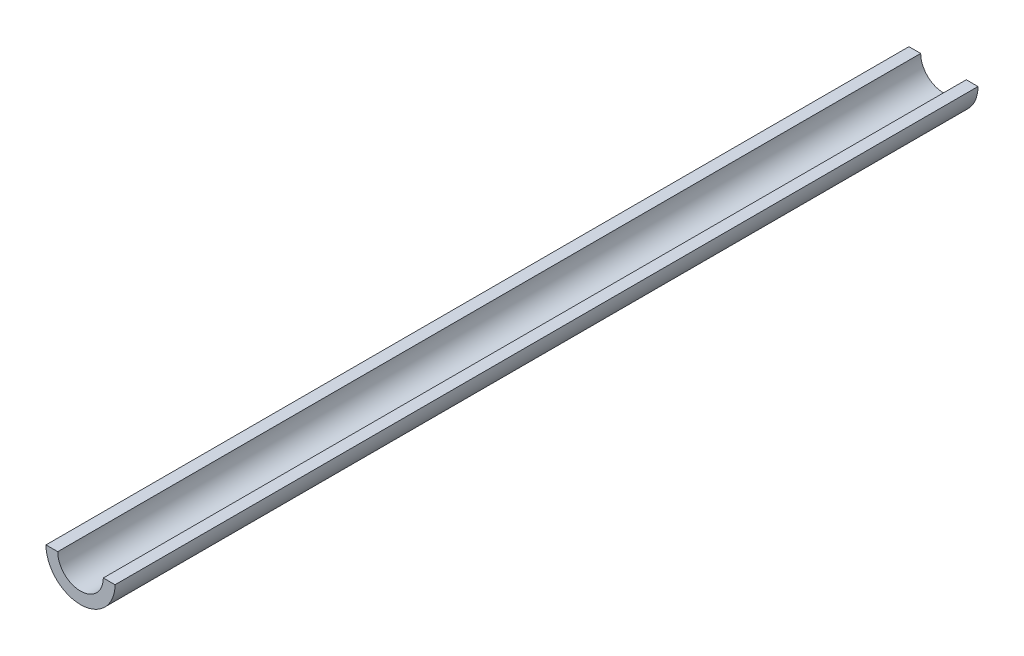
ISO-10303-21;
HEADER;
FILE_DESCRIPTION(('STEP AP214'),'2;1');
FILE_NAME('part.step','',(''),(''),'','','');
FILE_SCHEMA(('AUTOMOTIVE_DESIGN { 1 0 10303 214 1 1 1 1 }'));
ENDSEC;
DATA;
#1=APPLICATION_CONTEXT('core data for automotive mechanical design processes');
#2=APPLICATION_PROTOCOL_DEFINITION('international standard','automotive_design',2000,#1);
#3=PRODUCT_CONTEXT('',#1,'mechanical');
#4=PRODUCT('Part','Part','',(#3));
#5=PRODUCT_RELATED_PRODUCT_CATEGORY('part','',(#4));
#6=PRODUCT_DEFINITION_FORMATION('','',#4);
#7=PRODUCT_DEFINITION_CONTEXT('part definition',#1,'design');
#8=PRODUCT_DEFINITION('design','',#6,#7);
#9=PRODUCT_DEFINITION_SHAPE('','',#8);
#10=(LENGTH_UNIT() NAMED_UNIT(*) SI_UNIT(.MILLI.,.METRE.));
#11=(NAMED_UNIT(*) PLANE_ANGLE_UNIT() SI_UNIT($,.RADIAN.));
#12=(NAMED_UNIT(*) SI_UNIT($,.STERADIAN.) SOLID_ANGLE_UNIT());
#13=UNCERTAINTY_MEASURE_WITH_UNIT(LENGTH_MEASURE(1.E-05),#10,'distance_accuracy_value','');
#14=(GEOMETRIC_REPRESENTATION_CONTEXT(3) GLOBAL_UNCERTAINTY_ASSIGNED_CONTEXT((#13)) GLOBAL_UNIT_ASSIGNED_CONTEXT((#10,
#11,#12)) REPRESENTATION_CONTEXT('',''));
#15=CARTESIAN_POINT('',(0.,0.,0.));
#16=DIRECTION('',(0.,0.,1.));
#17=DIRECTION('',(1.,0.,0.));
#18=AXIS2_PLACEMENT_3D('',#15,#16,#17);
#19=CARTESIAN_POINT('',(0.,0.,125.));
#20=DIRECTION('',(0.,0.,-1.));
#21=DIRECTION('',(-1.,0.,0.));
#22=AXIS2_PLACEMENT_3D('',#19,#20,#21);
#23=CYLINDRICAL_SURFACE('',#22,6.6);
#24=CARTESIAN_POINT('',(0.,0.,-125.));
#25=DIRECTION('',(0.,0.,-1.));
#26=DIRECTION('',(1.,0.,0.));
#27=AXIS2_PLACEMENT_3D('',#24,#25,#26);
#28=CIRCLE('',#27,6.6);
#29=CARTESIAN_POINT('',(6.6,0.,-125.));
#30=VERTEX_POINT('',#29);
#31=CARTESIAN_POINT('',(-6.6,0.,-125.));
#32=VERTEX_POINT('',#31);
#33=EDGE_CURVE('E102',#30,#32,#28,.T.);
#34=ORIENTED_EDGE('',*,*,#33,.T.);
#35=DIRECTION('',(0.,0.,-1.));
#36=VECTOR('',#35,1.);
#37=CARTESIAN_POINT('',(-6.6,0.,125.));
#38=LINE('',#37,#36);
#39=CARTESIAN_POINT('',(-6.6,0.,125.));
#40=VERTEX_POINT('',#39);
#41=EDGE_CURVE('E11',#40,#32,#38,.T.);
#42=ORIENTED_EDGE('',*,*,#41,.F.);
#43=CARTESIAN_POINT('',(0.,0.,125.));
#44=DIRECTION('',(0.,0.,-1.));
#45=DIRECTION('',(1.,0.,0.));
#46=AXIS2_PLACEMENT_3D('',#43,#44,#45);
#47=CIRCLE('',#46,6.6);
#48=CARTESIAN_POINT('',(6.6,0.,125.));
#49=VERTEX_POINT('',#48);
#50=EDGE_CURVE('E95',#49,#40,#47,.T.);
#51=ORIENTED_EDGE('',*,*,#50,.F.);
#52=DIRECTION('',(0.,0.,-1.));
#53=VECTOR('',#52,1.);
#54=CARTESIAN_POINT('',(6.6,0.,125.));
#55=LINE('',#54,#53);
#56=EDGE_CURVE('E99',#49,#30,#55,.T.);
#57=ORIENTED_EDGE('',*,*,#56,.T.);
#58=EDGE_LOOP('',(#34,#42,#51,#57));
#59=FACE_BOUND('',#58,.T.);
#60=ADVANCED_FACE('F41',(#59),#23,.F.);
#61=CARTESIAN_POINT('',(-10.,0.,125.));
#62=DIRECTION('',(0.,-1.,0.));
#63=DIRECTION('',(0.,0.,-1.));
#64=AXIS2_PLACEMENT_3D('',#61,#62,#63);
#65=PLANE('',#64);
#66=DIRECTION('',(-1.,0.,0.));
#67=VECTOR('',#66,1.);
#68=CARTESIAN_POINT('',(-10.,0.,-125.));
#69=LINE('',#68,#67);
#70=CARTESIAN_POINT('',(-10.,0.,-125.));
#71=VERTEX_POINT('',#70);
#72=EDGE_CURVE('E96',#32,#71,#69,.T.);
#73=ORIENTED_EDGE('',*,*,#72,.T.);
#74=DIRECTION('',(0.,0.,-1.));
#75=VECTOR('',#74,1.);
#76=CARTESIAN_POINT('',(-10.,0.,125.));
#77=LINE('',#76,#75);
#78=CARTESIAN_POINT('',(-10.,0.,125.));
#79=VERTEX_POINT('',#78);
#80=EDGE_CURVE('E47',#79,#71,#77,.T.);
#81=ORIENTED_EDGE('',*,*,#80,.F.);
#82=DIRECTION('',(-1.,0.,0.));
#83=VECTOR('',#82,1.);
#84=CARTESIAN_POINT('',(-10.,0.,125.));
#85=LINE('',#84,#83);
#86=EDGE_CURVE('E87',#40,#79,#85,.T.);
#87=ORIENTED_EDGE('',*,*,#86,.F.);
#88=ORIENTED_EDGE('',*,*,#41,.T.);
#89=EDGE_LOOP('',(#73,#81,#87,#88));
#90=FACE_BOUND('',#89,.T.);
#91=ADVANCED_FACE('F92',(#90),#65,.F.);
#92=CARTESIAN_POINT('',(0.,0.,125.));
#93=DIRECTION('',(0.,0.,-1.));
#94=DIRECTION('',(-1.,0.,0.));
#95=AXIS2_PLACEMENT_3D('',#92,#93,#94);
#96=CYLINDRICAL_SURFACE('',#95,10.);
#97=CARTESIAN_POINT('',(0.,0.,-125.));
#98=DIRECTION('',(0.,0.,1.));
#99=DIRECTION('',(1.,0.,0.));
#100=AXIS2_PLACEMENT_3D('',#97,#98,#99);
#101=CIRCLE('',#100,10.);
#102=CARTESIAN_POINT('',(10.,0.,-125.));
#103=VERTEX_POINT('',#102);
#104=EDGE_CURVE('E74',#71,#103,#101,.T.);
#105=ORIENTED_EDGE('',*,*,#104,.T.);
#106=DIRECTION('',(0.,0.,-1.));
#107=VECTOR('',#106,1.);
#108=CARTESIAN_POINT('',(10.,0.,125.));
#109=LINE('',#108,#107);
#110=CARTESIAN_POINT('',(10.,0.,125.));
#111=VERTEX_POINT('',#110);
#112=EDGE_CURVE('E100',#111,#103,#109,.T.);
#113=ORIENTED_EDGE('',*,*,#112,.F.);
#114=CARTESIAN_POINT('',(0.,0.,125.));
#115=DIRECTION('',(0.,0.,1.));
#116=DIRECTION('',(1.,0.,0.));
#117=AXIS2_PLACEMENT_3D('',#114,#115,#116);
#118=CIRCLE('',#117,10.);
#119=EDGE_CURVE('E89',#79,#111,#118,.T.);
#120=ORIENTED_EDGE('',*,*,#119,.F.);
#121=ORIENTED_EDGE('',*,*,#80,.T.);
#122=EDGE_LOOP('',(#105,#113,#120,#121));
#123=FACE_BOUND('',#122,.T.);
#124=ADVANCED_FACE('F98',(#123),#96,.T.);
#125=CARTESIAN_POINT('',(6.6,0.,125.));
#126=DIRECTION('',(0.,-1.,0.));
#127=DIRECTION('',(0.,0.,-1.));
#128=AXIS2_PLACEMENT_3D('',#125,#126,#127);
#129=PLANE('',#128);
#130=DIRECTION('',(-1.,0.,0.));
#131=VECTOR('',#130,1.);
#132=CARTESIAN_POINT('',(6.6,0.,-125.));
#133=LINE('',#132,#131);
#134=EDGE_CURVE('E79',#103,#30,#133,.T.);
#135=ORIENTED_EDGE('',*,*,#134,.T.);
#136=ORIENTED_EDGE('',*,*,#56,.F.);
#137=DIRECTION('',(-1.,0.,0.));
#138=VECTOR('',#137,1.);
#139=CARTESIAN_POINT('',(6.6,0.,125.));
#140=LINE('',#139,#138);
#141=EDGE_CURVE('E60',#111,#49,#140,.T.);
#142=ORIENTED_EDGE('',*,*,#141,.F.);
#143=ORIENTED_EDGE('',*,*,#112,.T.);
#144=EDGE_LOOP('',(#135,#136,#142,#143));
#145=FACE_BOUND('',#144,.T.);
#146=ADVANCED_FACE('F112',(#145),#129,.F.);
#147=CARTESIAN_POINT('',(0.,0.,125.));
#148=DIRECTION('',(0.,0.,1.));
#149=DIRECTION('',(1.,0.,0.));
#150=AXIS2_PLACEMENT_3D('',#147,#148,#149);
#151=PLANE('',#150);
#152=ORIENTED_EDGE('',*,*,#50,.T.);
#153=ORIENTED_EDGE('',*,*,#86,.T.);
#154=ORIENTED_EDGE('',*,*,#119,.T.);
#155=ORIENTED_EDGE('',*,*,#141,.T.);
#156=EDGE_LOOP('',(#152,#153,#154,#155));
#157=FACE_BOUND('',#156,.T.);
#158=ADVANCED_FACE('F86',(#157),#151,.T.);
#159=CARTESIAN_POINT('',(0.,0.,-125.));
#160=DIRECTION('',(0.,0.,1.));
#161=DIRECTION('',(1.,0.,0.));
#162=AXIS2_PLACEMENT_3D('',#159,#160,#161);
#163=PLANE('',#162);
#164=ORIENTED_EDGE('',*,*,#33,.F.);
#165=ORIENTED_EDGE('',*,*,#134,.F.);
#166=ORIENTED_EDGE('',*,*,#104,.F.);
#167=ORIENTED_EDGE('',*,*,#72,.F.);
#168=EDGE_LOOP('',(#164,#165,#166,#167));
#169=FACE_BOUND('',#168,.T.);
#170=ADVANCED_FACE('F111',(#169),#163,.F.);
#171=CLOSED_SHELL('',(#60,#91,#124,#146,#158,#170));
#172=MANIFOLD_SOLID_BREP('B2',#171);
#173=ADVANCED_BREP_SHAPE_REPRESENTATION('',(#18,#172),#14);
#174=SHAPE_DEFINITION_REPRESENTATION(#9,#173);
ENDSEC;
END-ISO-10303-21;
